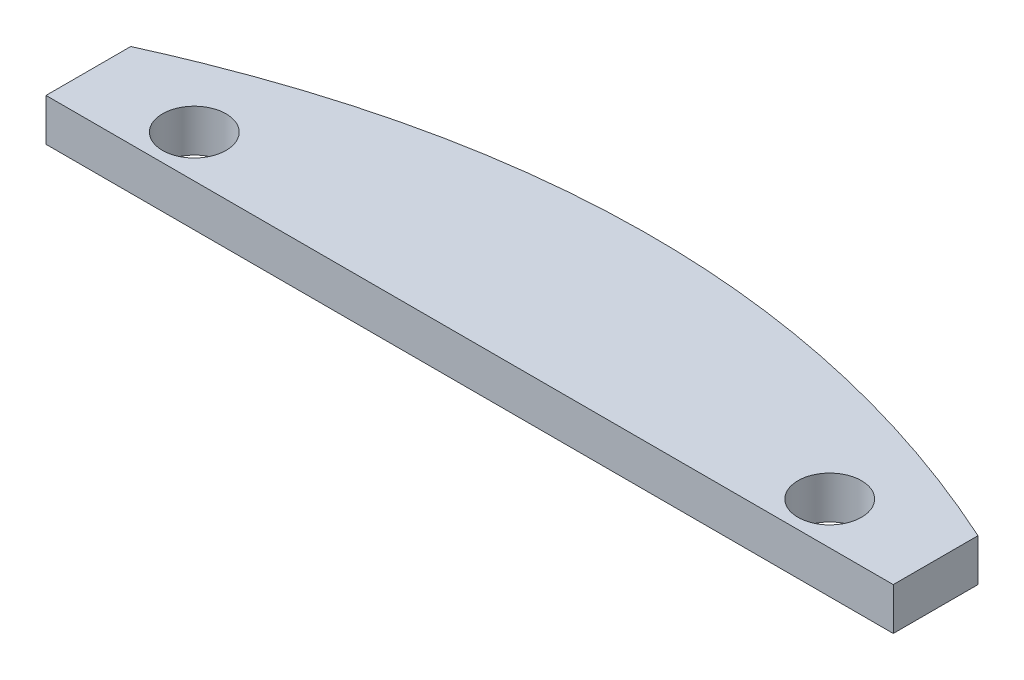
ISO-10303-21;
HEADER;
FILE_DESCRIPTION(('STEP AP214'),'2;1');
FILE_NAME('part.step','',(''),(''),'','','');
FILE_SCHEMA(('AUTOMOTIVE_DESIGN { 1 0 10303 214 1 1 1 1 }'));
ENDSEC;
DATA;
#1=APPLICATION_CONTEXT('core data for automotive mechanical design processes');
#2=APPLICATION_PROTOCOL_DEFINITION('international standard','automotive_design',2000,#1);
#3=PRODUCT_CONTEXT('',#1,'mechanical');
#4=PRODUCT('Part','Part','',(#3));
#5=PRODUCT_RELATED_PRODUCT_CATEGORY('part','',(#4));
#6=PRODUCT_DEFINITION_FORMATION('','',#4);
#7=PRODUCT_DEFINITION_CONTEXT('part definition',#1,'design');
#8=PRODUCT_DEFINITION('design','',#6,#7);
#9=PRODUCT_DEFINITION_SHAPE('','',#8);
#10=(LENGTH_UNIT() NAMED_UNIT(*) SI_UNIT(.MILLI.,.METRE.));
#11=(NAMED_UNIT(*) PLANE_ANGLE_UNIT() SI_UNIT($,.RADIAN.));
#12=(NAMED_UNIT(*) SI_UNIT($,.STERADIAN.) SOLID_ANGLE_UNIT());
#13=UNCERTAINTY_MEASURE_WITH_UNIT(LENGTH_MEASURE(1.E-05),#10,'distance_accuracy_value','');
#14=(GEOMETRIC_REPRESENTATION_CONTEXT(3) GLOBAL_UNCERTAINTY_ASSIGNED_CONTEXT((#13)) GLOBAL_UNIT_ASSIGNED_CONTEXT((#10,
#11,#12)) REPRESENTATION_CONTEXT('',''));
#15=CARTESIAN_POINT('',(0.,0.,0.));
#16=DIRECTION('',(0.,0.,1.));
#17=DIRECTION('',(1.,0.,0.));
#18=AXIS2_PLACEMENT_3D('',#15,#16,#17);
#19=CARTESIAN_POINT('',(3.92434988179669,2.,-10.5437352245863));
#20=DIRECTION('',(0.,1.,0.));
#21=DIRECTION('',(0.,0.,1.));
#22=AXIS2_PLACEMENT_3D('',#19,#20,#21);
#23=PLANE('',#22);
#24=CARTESIAN_POINT('',(-11.0756501182033,2.,-4.0047281323877));
#25=DIRECTION('',(0.,1.,0.));
#26=DIRECTION('',(0.,0.,1.));
#27=AXIS2_PLACEMENT_3D('',#24,#25,#26);
#28=CIRCLE('',#27,1.5);
#29=CARTESIAN_POINT('',(-11.0756501182033,2.,-2.5047281323877));
#30=VERTEX_POINT('',#29);
#31=EDGE_CURVE('E118',#30,#30,#28,.T.);
#32=ORIENTED_EDGE('',*,*,#31,.F.);
#33=EDGE_LOOP('',(#32));
#34=FACE_BOUND('',#33,.T.);
#35=CARTESIAN_POINT('',(23.9243498817967,2.,-6.0047281323877));
#36=CARTESIAN_POINT('',(3.92434988179669,2.,-15.0827423167849));
#37=CARTESIAN_POINT('',(-16.0756501182033,2.,-6.0047281323877));
#38=B_SPLINE_CURVE_WITH_KNOTS('',2,(#35,#36,#37),.UNSPECIFIED.,.F.,.F.,(3,3),(0.,1.),.UNSPECIFIED.);
#39=CARTESIAN_POINT('',(23.9243498817967,2.,-6.0047281323877));
#40=VERTEX_POINT('',#39);
#41=CARTESIAN_POINT('',(-16.0756501182033,2.,-6.0047281323877));
#42=VERTEX_POINT('',#41);
#43=EDGE_CURVE('E97',#40,#42,#38,.T.);
#44=ORIENTED_EDGE('',*,*,#43,.T.);
#45=DIRECTION('',(0.,0.,1.));
#46=VECTOR('',#45,1.);
#47=CARTESIAN_POINT('',(-16.0756501182033,2.,-6.0047281323877));
#48=LINE('',#47,#46);
#49=CARTESIAN_POINT('',(-16.0756501182033,2.,-2.0047281323877));
#50=VERTEX_POINT('',#49);
#51=EDGE_CURVE('E92',#42,#50,#48,.T.);
#52=ORIENTED_EDGE('',*,*,#51,.T.);
#53=DIRECTION('',(1.,0.,0.));
#54=VECTOR('',#53,1.);
#55=CARTESIAN_POINT('',(-16.0756501182033,2.,-2.0047281323877));
#56=LINE('',#55,#54);
#57=CARTESIAN_POINT('',(23.9243498817967,2.,-2.0047281323877));
#58=VERTEX_POINT('',#57);
#59=EDGE_CURVE('E95',#50,#58,#56,.T.);
#60=ORIENTED_EDGE('',*,*,#59,.T.);
#61=DIRECTION('',(0.,0.,-1.));
#62=VECTOR('',#61,1.);
#63=CARTESIAN_POINT('',(23.9243498817967,2.,-6.0047281323877));
#64=LINE('',#63,#62);
#65=EDGE_CURVE('E62',#58,#40,#64,.T.);
#66=ORIENTED_EDGE('',*,*,#65,.T.);
#67=EDGE_LOOP('',(#44,#52,#60,#66));
#68=FACE_BOUND('',#67,.T.);
#69=CARTESIAN_POINT('',(18.9243498817967,2.,-4.0047281323877));
#70=DIRECTION('',(0.,1.,0.));
#71=DIRECTION('',(0.,0.,-1.));
#72=AXIS2_PLACEMENT_3D('',#69,#70,#71);
#73=CIRCLE('',#72,1.5);
#74=CARTESIAN_POINT('',(18.9243498817967,2.,-5.5047281323877));
#75=VERTEX_POINT('',#74);
#76=EDGE_CURVE('E149',#75,#75,#73,.T.);
#77=ORIENTED_EDGE('',*,*,#76,.F.);
#78=EDGE_LOOP('',(#77));
#79=FACE_BOUND('',#78,.T.);
#80=ADVANCED_FACE('F43',(#34,#68,#79),#23,.T.);
#81=CARTESIAN_POINT('',(3.92434988179669,0.,-10.5437352245863));
#82=DIRECTION('',(0.,1.,0.));
#83=DIRECTION('',(0.,0.,1.));
#84=AXIS2_PLACEMENT_3D('',#81,#82,#83);
#85=PLANE('',#84);
#86=CARTESIAN_POINT('',(23.9243498817967,0.,-6.0047281323877));
#87=CARTESIAN_POINT('',(3.92434988179669,0.,-15.0827423167849));
#88=CARTESIAN_POINT('',(-16.0756501182033,0.,-6.0047281323877));
#89=B_SPLINE_CURVE_WITH_KNOTS('',2,(#86,#87,#88),.UNSPECIFIED.,.F.,.F.,(3,3),(0.,1.),.UNSPECIFIED.);
#90=CARTESIAN_POINT('',(23.9243498817967,0.,-6.0047281323877));
#91=VERTEX_POINT('',#90);
#92=CARTESIAN_POINT('',(-16.0756501182033,0.,-6.0047281323877));
#93=VERTEX_POINT('',#92);
#94=EDGE_CURVE('E112',#91,#93,#89,.T.);
#95=ORIENTED_EDGE('',*,*,#94,.F.);
#96=DIRECTION('',(0.,0.,-1.));
#97=VECTOR('',#96,1.);
#98=CARTESIAN_POINT('',(23.9243498817967,0.,-6.0047281323877));
#99=LINE('',#98,#97);
#100=CARTESIAN_POINT('',(23.9243498817967,0.,-2.0047281323877));
#101=VERTEX_POINT('',#100);
#102=EDGE_CURVE('E85',#101,#91,#99,.T.);
#103=ORIENTED_EDGE('',*,*,#102,.F.);
#104=DIRECTION('',(1.,0.,0.));
#105=VECTOR('',#104,1.);
#106=CARTESIAN_POINT('',(-16.0756501182033,0.,-2.0047281323877));
#107=LINE('',#106,#105);
#108=CARTESIAN_POINT('',(-16.0756501182033,0.,-2.0047281323877));
#109=VERTEX_POINT('',#108);
#110=EDGE_CURVE('E79',#109,#101,#107,.T.);
#111=ORIENTED_EDGE('',*,*,#110,.F.);
#112=DIRECTION('',(0.,0.,1.));
#113=VECTOR('',#112,1.);
#114=CARTESIAN_POINT('',(-16.0756501182033,0.,-6.0047281323877));
#115=LINE('',#114,#113);
#116=EDGE_CURVE('E102',#93,#109,#115,.T.);
#117=ORIENTED_EDGE('',*,*,#116,.F.);
#118=EDGE_LOOP('',(#95,#103,#111,#117));
#119=FACE_BOUND('',#118,.T.);
#120=CARTESIAN_POINT('',(-11.0756501182033,0.,-4.0047281323877));
#121=DIRECTION('',(0.,1.,0.));
#122=DIRECTION('',(0.,0.,1.));
#123=AXIS2_PLACEMENT_3D('',#120,#121,#122);
#124=CIRCLE('',#123,1.5);
#125=CARTESIAN_POINT('',(-11.0756501182033,0.,-2.5047281323877));
#126=VERTEX_POINT('',#125);
#127=EDGE_CURVE('E142',#126,#126,#124,.T.);
#128=ORIENTED_EDGE('',*,*,#127,.T.);
#129=EDGE_LOOP('',(#128));
#130=FACE_BOUND('',#129,.T.);
#131=CARTESIAN_POINT('',(18.9243498817967,0.,-4.0047281323877));
#132=DIRECTION('',(0.,1.,0.));
#133=DIRECTION('',(0.,0.,-1.));
#134=AXIS2_PLACEMENT_3D('',#131,#132,#133);
#135=CIRCLE('',#134,1.5);
#136=CARTESIAN_POINT('',(18.9243498817967,0.,-5.5047281323877));
#137=VERTEX_POINT('',#136);
#138=EDGE_CURVE('E153',#137,#137,#135,.T.);
#139=ORIENTED_EDGE('',*,*,#138,.T.);
#140=EDGE_LOOP('',(#139));
#141=FACE_BOUND('',#140,.T.);
#142=ADVANCED_FACE('F134',(#119,#130,#141),#85,.F.);
#143=DIRECTION('',(0.,-1.,0.));
#144=VECTOR('',#143,1.);
#145=SURFACE_OF_LINEAR_EXTRUSION('',#38,#144);
#146=ORIENTED_EDGE('',*,*,#94,.T.);
#147=DIRECTION('',(0.,-1.,0.));
#148=VECTOR('',#147,1.);
#149=CARTESIAN_POINT('',(-16.0756501182033,2.,-6.0047281323877));
#150=LINE('',#149,#148);
#151=EDGE_CURVE('E11',#42,#93,#150,.T.);
#152=ORIENTED_EDGE('',*,*,#151,.F.);
#153=ORIENTED_EDGE('',*,*,#43,.F.);
#154=DIRECTION('',(0.,-1.,0.));
#155=VECTOR('',#154,1.);
#156=CARTESIAN_POINT('',(23.9243498817967,2.,-6.0047281323877));
#157=LINE('',#156,#155);
#158=EDGE_CURVE('E109',#40,#91,#157,.T.);
#159=ORIENTED_EDGE('',*,*,#158,.T.);
#160=EDGE_LOOP('',(#146,#152,#153,#159));
#161=FACE_BOUND('',#160,.T.);
#162=ADVANCED_FACE('F45',(#161),#145,.F.);
#163=CARTESIAN_POINT('',(-16.0756501182033,2.,-6.0047281323877));
#164=DIRECTION('',(1.,0.,0.));
#165=DIRECTION('',(0.,0.,-1.));
#166=AXIS2_PLACEMENT_3D('',#163,#164,#165);
#167=PLANE('',#166);
#168=ORIENTED_EDGE('',*,*,#116,.T.);
#169=DIRECTION('',(0.,-1.,0.));
#170=VECTOR('',#169,1.);
#171=CARTESIAN_POINT('',(-16.0756501182033,2.,-2.0047281323877));
#172=LINE('',#171,#170);
#173=EDGE_CURVE('E54',#50,#109,#172,.T.);
#174=ORIENTED_EDGE('',*,*,#173,.F.);
#175=ORIENTED_EDGE('',*,*,#51,.F.);
#176=ORIENTED_EDGE('',*,*,#151,.T.);
#177=EDGE_LOOP('',(#168,#174,#175,#176));
#178=FACE_BOUND('',#177,.T.);
#179=ADVANCED_FACE('F101',(#178),#167,.F.);
#180=CARTESIAN_POINT('',(-16.0756501182033,2.,-2.0047281323877));
#181=DIRECTION('',(0.,0.,-1.));
#182=DIRECTION('',(-1.,0.,0.));
#183=AXIS2_PLACEMENT_3D('',#180,#181,#182);
#184=PLANE('',#183);
#185=ORIENTED_EDGE('',*,*,#110,.T.);
#186=DIRECTION('',(0.,-1.,0.));
#187=VECTOR('',#186,1.);
#188=CARTESIAN_POINT('',(23.9243498817967,2.,-2.0047281323877));
#189=LINE('',#188,#187);
#190=EDGE_CURVE('E104',#58,#101,#189,.T.);
#191=ORIENTED_EDGE('',*,*,#190,.F.);
#192=ORIENTED_EDGE('',*,*,#59,.F.);
#193=ORIENTED_EDGE('',*,*,#173,.T.);
#194=EDGE_LOOP('',(#185,#191,#192,#193));
#195=FACE_BOUND('',#194,.T.);
#196=ADVANCED_FACE('F105',(#195),#184,.F.);
#197=CARTESIAN_POINT('',(23.9243498817967,2.,-6.0047281323877));
#198=DIRECTION('',(-1.,0.,0.));
#199=DIRECTION('',(0.,0.,1.));
#200=AXIS2_PLACEMENT_3D('',#197,#198,#199);
#201=PLANE('',#200);
#202=ORIENTED_EDGE('',*,*,#102,.T.);
#203=ORIENTED_EDGE('',*,*,#158,.F.);
#204=ORIENTED_EDGE('',*,*,#65,.F.);
#205=ORIENTED_EDGE('',*,*,#190,.T.);
#206=EDGE_LOOP('',(#202,#203,#204,#205));
#207=FACE_BOUND('',#206,.T.);
#208=ADVANCED_FACE('F131',(#207),#201,.F.);
#209=CARTESIAN_POINT('',(-11.0756501182033,2.,-4.0047281323877));
#210=DIRECTION('',(0.,-1.,0.));
#211=DIRECTION('',(0.,0.,-1.));
#212=AXIS2_PLACEMENT_3D('',#209,#210,#211);
#213=CYLINDRICAL_SURFACE('',#212,1.5);
#214=ORIENTED_EDGE('',*,*,#31,.T.);
#215=EDGE_LOOP('',(#214));
#216=FACE_BOUND('',#215,.T.);
#217=ORIENTED_EDGE('',*,*,#127,.F.);
#218=EDGE_LOOP('',(#217));
#219=FACE_BOUND('',#218,.T.);
#220=ADVANCED_FACE('F172',(#216,#219),#213,.F.);
#221=CARTESIAN_POINT('',(18.9243498817967,2.,-4.0047281323877));
#222=DIRECTION('',(0.,-1.,0.));
#223=DIRECTION('',(0.,0.,-1.));
#224=AXIS2_PLACEMENT_3D('',#221,#222,#223);
#225=CYLINDRICAL_SURFACE('',#224,1.5);
#226=ORIENTED_EDGE('',*,*,#76,.T.);
#227=EDGE_LOOP('',(#226));
#228=FACE_BOUND('',#227,.T.);
#229=ORIENTED_EDGE('',*,*,#138,.F.);
#230=EDGE_LOOP('',(#229));
#231=FACE_BOUND('',#230,.T.);
#232=ADVANCED_FACE('F161',(#228,#231),#225,.F.);
#233=CLOSED_SHELL('',(#80,#142,#162,#179,#196,#208,#220,#232));
#234=MANIFOLD_SOLID_BREP('B2',#233);
#235=ADVANCED_BREP_SHAPE_REPRESENTATION('',(#18,#234),#14);
#236=SHAPE_DEFINITION_REPRESENTATION(#9,#235);
ENDSEC;
END-ISO-10303-21;
